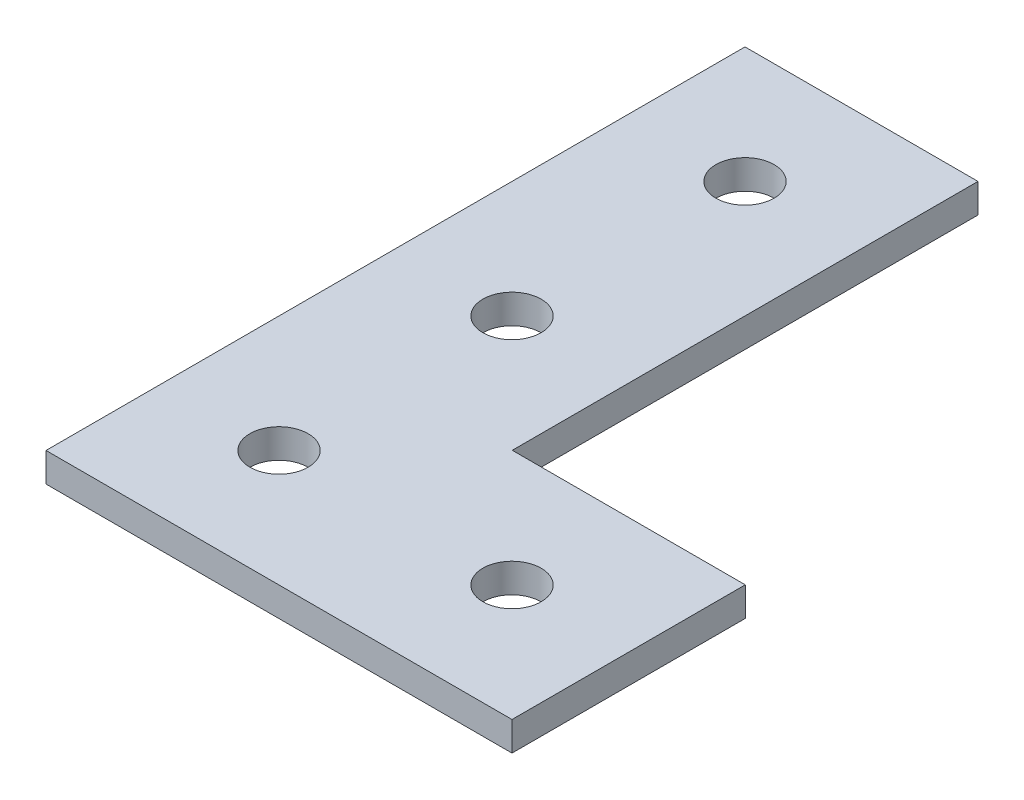
ISO-10303-21;
HEADER;
FILE_DESCRIPTION(('STEP AP214'),'2;1');
FILE_NAME('part.step','',(''),(''),'','','');
FILE_SCHEMA(('AUTOMOTIVE_DESIGN { 1 0 10303 214 1 1 1 1 }'));
ENDSEC;
DATA;
#1=APPLICATION_CONTEXT('core data for automotive mechanical design processes');
#2=APPLICATION_PROTOCOL_DEFINITION('international standard','automotive_design',2000,#1);
#3=PRODUCT_CONTEXT('',#1,'mechanical');
#4=PRODUCT('Part','Part','',(#3));
#5=PRODUCT_RELATED_PRODUCT_CATEGORY('part','',(#4));
#6=PRODUCT_DEFINITION_FORMATION('','',#4);
#7=PRODUCT_DEFINITION_CONTEXT('part definition',#1,'design');
#8=PRODUCT_DEFINITION('design','',#6,#7);
#9=PRODUCT_DEFINITION_SHAPE('','',#8);
#10=(LENGTH_UNIT() NAMED_UNIT(*) SI_UNIT(.MILLI.,.METRE.));
#11=(NAMED_UNIT(*) PLANE_ANGLE_UNIT() SI_UNIT($,.RADIAN.));
#12=(NAMED_UNIT(*) SI_UNIT($,.STERADIAN.) SOLID_ANGLE_UNIT());
#13=UNCERTAINTY_MEASURE_WITH_UNIT(LENGTH_MEASURE(1.E-05),#10,'distance_accuracy_value','');
#14=(GEOMETRIC_REPRESENTATION_CONTEXT(3) GLOBAL_UNCERTAINTY_ASSIGNED_CONTEXT((#13)) GLOBAL_UNIT_ASSIGNED_CONTEXT((#10,
#11,#12)) REPRESENTATION_CONTEXT('',''));
#15=CARTESIAN_POINT('',(0.,0.,0.));
#16=DIRECTION('',(0.,0.,1.));
#17=DIRECTION('',(1.,0.,0.));
#18=AXIS2_PLACEMENT_3D('',#15,#16,#17);
#19=CARTESIAN_POINT('',(50.8,3.175,0.));
#20=DIRECTION('',(0.,0.,-1.));
#21=DIRECTION('',(-1.,0.,0.));
#22=AXIS2_PLACEMENT_3D('',#19,#20,#21);
#23=PLANE('',#22);
#24=DIRECTION('',(1.,0.,0.));
#25=VECTOR('',#24,1.);
#26=CARTESIAN_POINT('',(50.8,0.,0.));
#27=LINE('',#26,#25);
#28=CARTESIAN_POINT('',(0.,0.,0.));
#29=VERTEX_POINT('',#28);
#30=CARTESIAN_POINT('',(50.8,0.,0.));
#31=VERTEX_POINT('',#30);
#32=EDGE_CURVE('E120',#29,#31,#27,.T.);
#33=ORIENTED_EDGE('',*,*,#32,.T.);
#34=DIRECTION('',(0.,-1.,0.));
#35=VECTOR('',#34,1.);
#36=CARTESIAN_POINT('',(50.8,3.175,0.));
#37=LINE('',#36,#35);
#38=CARTESIAN_POINT('',(50.8,3.175,0.));
#39=VERTEX_POINT('',#38);
#40=EDGE_CURVE('E138',#39,#31,#37,.T.);
#41=ORIENTED_EDGE('',*,*,#40,.F.);
#42=DIRECTION('',(1.,0.,0.));
#43=VECTOR('',#42,1.);
#44=CARTESIAN_POINT('',(50.8,3.175,0.));
#45=LINE('',#44,#43);
#46=CARTESIAN_POINT('',(0.,3.175,0.));
#47=VERTEX_POINT('',#46);
#48=EDGE_CURVE('E131',#47,#39,#45,.T.);
#49=ORIENTED_EDGE('',*,*,#48,.F.);
#50=DIRECTION('',(0.,-1.,0.));
#51=VECTOR('',#50,1.);
#52=CARTESIAN_POINT('',(0.,3.175,0.));
#53=LINE('',#52,#51);
#54=EDGE_CURVE('E116',#47,#29,#53,.T.);
#55=ORIENTED_EDGE('',*,*,#54,.T.);
#56=EDGE_LOOP('',(#33,#41,#49,#55));
#57=FACE_BOUND('',#56,.T.);
#58=ADVANCED_FACE('F33',(#57),#23,.F.);
#59=CARTESIAN_POINT('',(50.8,3.175,-25.4295869461767));
#60=DIRECTION('',(-1.,0.,0.));
#61=DIRECTION('',(0.,0.,1.));
#62=AXIS2_PLACEMENT_3D('',#59,#60,#61);
#63=PLANE('',#62);
#64=DIRECTION('',(0.,0.,-1.));
#65=VECTOR('',#64,1.);
#66=CARTESIAN_POINT('',(50.8,0.,-25.4295869461767));
#67=LINE('',#66,#65);
#68=CARTESIAN_POINT('',(50.8,0.,-25.4295869461767));
#69=VERTEX_POINT('',#68);
#70=EDGE_CURVE('E123',#31,#69,#67,.T.);
#71=ORIENTED_EDGE('',*,*,#70,.T.);
#72=DIRECTION('',(0.,-1.,0.));
#73=VECTOR('',#72,1.);
#74=CARTESIAN_POINT('',(50.8,3.175,-25.4295869461767));
#75=LINE('',#74,#73);
#76=CARTESIAN_POINT('',(50.8,3.175,-25.4295869461767));
#77=VERTEX_POINT('',#76);
#78=EDGE_CURVE('E135',#77,#69,#75,.T.);
#79=ORIENTED_EDGE('',*,*,#78,.F.);
#80=DIRECTION('',(0.,0.,-1.));
#81=VECTOR('',#80,1.);
#82=CARTESIAN_POINT('',(50.8,3.175,-25.4295869461767));
#83=LINE('',#82,#81);
#84=EDGE_CURVE('E88',#39,#77,#83,.T.);
#85=ORIENTED_EDGE('',*,*,#84,.F.);
#86=ORIENTED_EDGE('',*,*,#40,.T.);
#87=EDGE_LOOP('',(#71,#79,#85,#86));
#88=FACE_BOUND('',#87,.T.);
#89=ADVANCED_FACE('F165',(#88),#63,.F.);
#90=CARTESIAN_POINT('',(25.4,3.175,-25.4295869461767));
#91=DIRECTION('',(0.,0.,1.));
#92=DIRECTION('',(1.,0.,0.));
#93=AXIS2_PLACEMENT_3D('',#90,#91,#92);
#94=PLANE('',#93);
#95=DIRECTION('',(-1.,0.,0.));
#96=VECTOR('',#95,1.);
#97=CARTESIAN_POINT('',(25.4,0.,-25.4295869461767));
#98=LINE('',#97,#96);
#99=CARTESIAN_POINT('',(25.4,0.,-25.4295869461767));
#100=VERTEX_POINT('',#99);
#101=EDGE_CURVE('E126',#69,#100,#98,.T.);
#102=ORIENTED_EDGE('',*,*,#101,.T.);
#103=DIRECTION('',(0.,-1.,0.));
#104=VECTOR('',#103,1.);
#105=CARTESIAN_POINT('',(25.4,3.175,-25.4295869461767));
#106=LINE('',#105,#104);
#107=CARTESIAN_POINT('',(25.4,3.175,-25.4295869461767));
#108=VERTEX_POINT('',#107);
#109=EDGE_CURVE('E111',#108,#100,#106,.T.);
#110=ORIENTED_EDGE('',*,*,#109,.F.);
#111=DIRECTION('',(-1.,0.,0.));
#112=VECTOR('',#111,1.);
#113=CARTESIAN_POINT('',(25.4,3.175,-25.4295869461767));
#114=LINE('',#113,#112);
#115=EDGE_CURVE('E102',#77,#108,#114,.T.);
#116=ORIENTED_EDGE('',*,*,#115,.F.);
#117=ORIENTED_EDGE('',*,*,#78,.T.);
#118=EDGE_LOOP('',(#102,#110,#116,#117));
#119=FACE_BOUND('',#118,.T.);
#120=ADVANCED_FACE('F170',(#119),#94,.F.);
#121=CARTESIAN_POINT('',(25.4,3.175,-76.2));
#122=DIRECTION('',(-1.,0.,0.));
#123=DIRECTION('',(0.,0.,1.));
#124=AXIS2_PLACEMENT_3D('',#121,#122,#123);
#125=PLANE('',#124);
#126=DIRECTION('',(0.,0.,-1.));
#127=VECTOR('',#126,1.);
#128=CARTESIAN_POINT('',(25.4,0.,-76.2));
#129=LINE('',#128,#127);
#130=CARTESIAN_POINT('',(25.4,0.,-76.2));
#131=VERTEX_POINT('',#130);
#132=EDGE_CURVE('E110',#100,#131,#129,.T.);
#133=ORIENTED_EDGE('',*,*,#132,.T.);
#134=DIRECTION('',(0.,-1.,0.));
#135=VECTOR('',#134,1.);
#136=CARTESIAN_POINT('',(25.4,3.175,-76.2));
#137=LINE('',#136,#135);
#138=CARTESIAN_POINT('',(25.4,3.175,-76.2));
#139=VERTEX_POINT('',#138);
#140=EDGE_CURVE('E107',#139,#131,#137,.T.);
#141=ORIENTED_EDGE('',*,*,#140,.F.);
#142=DIRECTION('',(0.,0.,-1.));
#143=VECTOR('',#142,1.);
#144=CARTESIAN_POINT('',(25.4,3.175,-76.2));
#145=LINE('',#144,#143);
#146=EDGE_CURVE('E95',#108,#139,#145,.T.);
#147=ORIENTED_EDGE('',*,*,#146,.F.);
#148=ORIENTED_EDGE('',*,*,#109,.T.);
#149=EDGE_LOOP('',(#133,#141,#147,#148));
#150=FACE_BOUND('',#149,.T.);
#151=ADVANCED_FACE('F108',(#150),#125,.F.);
#152=CARTESIAN_POINT('',(0.,3.175,-76.2));
#153=DIRECTION('',(0.,0.,1.));
#154=DIRECTION('',(1.,0.,0.));
#155=AXIS2_PLACEMENT_3D('',#152,#153,#154);
#156=PLANE('',#155);
#157=DIRECTION('',(-1.,0.,0.));
#158=VECTOR('',#157,1.);
#159=CARTESIAN_POINT('',(0.,0.,-76.2));
#160=LINE('',#159,#158);
#161=CARTESIAN_POINT('',(0.,0.,-76.2));
#162=VERTEX_POINT('',#161);
#163=EDGE_CURVE('E73',#131,#162,#160,.T.);
#164=ORIENTED_EDGE('',*,*,#163,.T.);
#165=DIRECTION('',(0.,-1.,0.));
#166=VECTOR('',#165,1.);
#167=CARTESIAN_POINT('',(0.,3.175,-76.2));
#168=LINE('',#167,#166);
#169=CARTESIAN_POINT('',(0.,3.175,-76.2));
#170=VERTEX_POINT('',#169);
#171=EDGE_CURVE('E112',#170,#162,#168,.T.);
#172=ORIENTED_EDGE('',*,*,#171,.F.);
#173=DIRECTION('',(-1.,0.,0.));
#174=VECTOR('',#173,1.);
#175=CARTESIAN_POINT('',(0.,3.175,-76.2));
#176=LINE('',#175,#174);
#177=EDGE_CURVE('E100',#139,#170,#176,.T.);
#178=ORIENTED_EDGE('',*,*,#177,.F.);
#179=ORIENTED_EDGE('',*,*,#140,.T.);
#180=EDGE_LOOP('',(#164,#172,#178,#179));
#181=FACE_BOUND('',#180,.T.);
#182=ADVANCED_FACE('F114',(#181),#156,.F.);
#183=CARTESIAN_POINT('',(0.,3.175,0.));
#184=DIRECTION('',(1.,0.,0.));
#185=DIRECTION('',(0.,0.,-1.));
#186=AXIS2_PLACEMENT_3D('',#183,#184,#185);
#187=PLANE('',#186);
#188=DIRECTION('',(0.,0.,1.));
#189=VECTOR('',#188,1.);
#190=CARTESIAN_POINT('',(0.,0.,0.));
#191=LINE('',#190,#189);
#192=EDGE_CURVE('E79',#162,#29,#191,.T.);
#193=ORIENTED_EDGE('',*,*,#192,.T.);
#194=ORIENTED_EDGE('',*,*,#54,.F.);
#195=DIRECTION('',(0.,0.,1.));
#196=VECTOR('',#195,1.);
#197=CARTESIAN_POINT('',(0.,3.175,0.));
#198=LINE('',#197,#196);
#199=EDGE_CURVE('E50',#170,#47,#198,.T.);
#200=ORIENTED_EDGE('',*,*,#199,.F.);
#201=ORIENTED_EDGE('',*,*,#171,.T.);
#202=EDGE_LOOP('',(#193,#194,#200,#201));
#203=FACE_BOUND('',#202,.T.);
#204=ADVANCED_FACE('F150',(#203),#187,.F.);
#205=CARTESIAN_POINT('',(0.,3.175,0.));
#206=DIRECTION('',(0.,-1.,0.));
#207=DIRECTION('',(0.,0.,-1.));
#208=AXIS2_PLACEMENT_3D('',#205,#206,#207);
#209=PLANE('',#208);
#210=CARTESIAN_POINT('',(38.1,3.175,-12.7));
#211=DIRECTION('',(0.,1.,0.));
#212=DIRECTION('',(0.,0.,1.));
#213=AXIS2_PLACEMENT_3D('',#210,#211,#212);
#214=CIRCLE('',#213,3.175);
#215=CARTESIAN_POINT('',(38.1,3.175,-9.525));
#216=VERTEX_POINT('',#215);
#217=EDGE_CURVE('E238',#216,#216,#214,.T.);
#218=ORIENTED_EDGE('',*,*,#217,.F.);
#219=EDGE_LOOP('',(#218));
#220=FACE_BOUND('',#219,.T.);
#221=CARTESIAN_POINT('',(12.7,3.175,-38.1));
#222=DIRECTION('',(0.,1.,0.));
#223=DIRECTION('',(0.,0.,1.));
#224=AXIS2_PLACEMENT_3D('',#221,#222,#223);
#225=CIRCLE('',#224,3.175);
#226=CARTESIAN_POINT('',(12.7,3.175,-34.925));
#227=VERTEX_POINT('',#226);
#228=EDGE_CURVE('E245',#227,#227,#225,.T.);
#229=ORIENTED_EDGE('',*,*,#228,.F.);
#230=EDGE_LOOP('',(#229));
#231=FACE_BOUND('',#230,.T.);
#232=CARTESIAN_POINT('',(12.7,3.175,-12.7));
#233=DIRECTION('',(0.,1.,0.));
#234=DIRECTION('',(0.,0.,1.));
#235=AXIS2_PLACEMENT_3D('',#232,#233,#234);
#236=CIRCLE('',#235,3.175);
#237=CARTESIAN_POINT('',(12.7,3.175,-9.525));
#238=VERTEX_POINT('',#237);
#239=EDGE_CURVE('E248',#238,#238,#236,.T.);
#240=ORIENTED_EDGE('',*,*,#239,.F.);
#241=EDGE_LOOP('',(#240));
#242=FACE_BOUND('',#241,.T.);
#243=ORIENTED_EDGE('',*,*,#48,.T.);
#244=ORIENTED_EDGE('',*,*,#84,.T.);
#245=ORIENTED_EDGE('',*,*,#115,.T.);
#246=ORIENTED_EDGE('',*,*,#146,.T.);
#247=ORIENTED_EDGE('',*,*,#177,.T.);
#248=ORIENTED_EDGE('',*,*,#199,.T.);
#249=EDGE_LOOP('',(#243,#244,#245,#246,#247,#248));
#250=FACE_BOUND('',#249,.T.);
#251=CARTESIAN_POINT('',(12.7,3.175,-63.5));
#252=DIRECTION('',(0.,1.,0.));
#253=DIRECTION('',(0.,0.,1.));
#254=AXIS2_PLACEMENT_3D('',#251,#252,#253);
#255=CIRCLE('',#254,3.175);
#256=CARTESIAN_POINT('',(12.7,3.175,-60.325));
#257=VERTEX_POINT('',#256);
#258=EDGE_CURVE('E11',#257,#257,#255,.T.);
#259=ORIENTED_EDGE('',*,*,#258,.F.);
#260=EDGE_LOOP('',(#259));
#261=FACE_BOUND('',#260,.T.);
#262=ADVANCED_FACE('F97',(#220,#231,#242,#250,#261),#209,.F.);
#263=CARTESIAN_POINT('',(0.,0.,0.));
#264=DIRECTION('',(0.,-1.,0.));
#265=DIRECTION('',(0.,0.,-1.));
#266=AXIS2_PLACEMENT_3D('',#263,#264,#265);
#267=PLANE('',#266);
#268=CARTESIAN_POINT('',(38.1,0.,-12.7));
#269=DIRECTION('',(0.,1.,0.));
#270=DIRECTION('',(0.,0.,1.));
#271=AXIS2_PLACEMENT_3D('',#268,#269,#270);
#272=CIRCLE('',#271,3.175);
#273=CARTESIAN_POINT('',(38.1,0.,-9.525));
#274=VERTEX_POINT('',#273);
#275=EDGE_CURVE('E236',#274,#274,#272,.T.);
#276=ORIENTED_EDGE('',*,*,#275,.T.);
#277=EDGE_LOOP('',(#276));
#278=FACE_BOUND('',#277,.T.);
#279=CARTESIAN_POINT('',(12.7,0.,-38.1));
#280=DIRECTION('',(0.,1.,0.));
#281=DIRECTION('',(0.,0.,1.));
#282=AXIS2_PLACEMENT_3D('',#279,#280,#281);
#283=CIRCLE('',#282,3.175);
#284=CARTESIAN_POINT('',(12.7,0.,-34.925));
#285=VERTEX_POINT('',#284);
#286=EDGE_CURVE('E240',#285,#285,#283,.T.);
#287=ORIENTED_EDGE('',*,*,#286,.T.);
#288=EDGE_LOOP('',(#287));
#289=FACE_BOUND('',#288,.T.);
#290=CARTESIAN_POINT('',(12.7,0.,-12.7));
#291=DIRECTION('',(0.,1.,0.));
#292=DIRECTION('',(0.,0.,1.));
#293=AXIS2_PLACEMENT_3D('',#290,#291,#292);
#294=CIRCLE('',#293,3.175);
#295=CARTESIAN_POINT('',(12.7,0.,-9.525));
#296=VERTEX_POINT('',#295);
#297=EDGE_CURVE('E124',#296,#296,#294,.T.);
#298=ORIENTED_EDGE('',*,*,#297,.T.);
#299=EDGE_LOOP('',(#298));
#300=FACE_BOUND('',#299,.T.);
#301=ORIENTED_EDGE('',*,*,#32,.F.);
#302=ORIENTED_EDGE('',*,*,#192,.F.);
#303=ORIENTED_EDGE('',*,*,#163,.F.);
#304=ORIENTED_EDGE('',*,*,#132,.F.);
#305=ORIENTED_EDGE('',*,*,#101,.F.);
#306=ORIENTED_EDGE('',*,*,#70,.F.);
#307=EDGE_LOOP('',(#301,#302,#303,#304,#305,#306));
#308=FACE_BOUND('',#307,.T.);
#309=CARTESIAN_POINT('',(12.7,0.,-63.5));
#310=DIRECTION('',(0.,1.,0.));
#311=DIRECTION('',(0.,0.,1.));
#312=AXIS2_PLACEMENT_3D('',#309,#310,#311);
#313=CIRCLE('',#312,3.175);
#314=CARTESIAN_POINT('',(12.7,0.,-60.325));
#315=VERTEX_POINT('',#314);
#316=EDGE_CURVE('E42',#315,#315,#313,.T.);
#317=ORIENTED_EDGE('',*,*,#316,.T.);
#318=EDGE_LOOP('',(#317));
#319=FACE_BOUND('',#318,.T.);
#320=ADVANCED_FACE('F142',(#278,#289,#300,#308,#319),#267,.T.);
#321=CARTESIAN_POINT('',(12.7,0.,-12.7));
#322=DIRECTION('',(0.,1.,0.));
#323=DIRECTION('',(0.,0.,1.));
#324=AXIS2_PLACEMENT_3D('',#321,#322,#323);
#325=CYLINDRICAL_SURFACE('',#324,3.175);
#326=ORIENTED_EDGE('',*,*,#297,.F.);
#327=EDGE_LOOP('',(#326));
#328=FACE_BOUND('',#327,.T.);
#329=ORIENTED_EDGE('',*,*,#239,.T.);
#330=EDGE_LOOP('',(#329));
#331=FACE_BOUND('',#330,.T.);
#332=ADVANCED_FACE('F157',(#328,#331),#325,.F.);
#333=CARTESIAN_POINT('',(12.7,0.,-38.1));
#334=DIRECTION('',(0.,1.,0.));
#335=DIRECTION('',(0.,0.,1.));
#336=AXIS2_PLACEMENT_3D('',#333,#334,#335);
#337=CYLINDRICAL_SURFACE('',#336,3.175);
#338=ORIENTED_EDGE('',*,*,#286,.F.);
#339=EDGE_LOOP('',(#338));
#340=FACE_BOUND('',#339,.T.);
#341=ORIENTED_EDGE('',*,*,#228,.T.);
#342=EDGE_LOOP('',(#341));
#343=FACE_BOUND('',#342,.T.);
#344=ADVANCED_FACE('F147',(#340,#343),#337,.F.);
#345=CARTESIAN_POINT('',(12.7,0.,-63.5));
#346=DIRECTION('',(0.,1.,0.));
#347=DIRECTION('',(0.,0.,1.));
#348=AXIS2_PLACEMENT_3D('',#345,#346,#347);
#349=CYLINDRICAL_SURFACE('',#348,3.175);
#350=ORIENTED_EDGE('',*,*,#316,.F.);
#351=EDGE_LOOP('',(#350));
#352=FACE_BOUND('',#351,.T.);
#353=ORIENTED_EDGE('',*,*,#258,.T.);
#354=EDGE_LOOP('',(#353));
#355=FACE_BOUND('',#354,.T.);
#356=ADVANCED_FACE('F35',(#352,#355),#349,.F.);
#357=CARTESIAN_POINT('',(38.1,0.,-12.7));
#358=DIRECTION('',(0.,1.,0.));
#359=DIRECTION('',(0.,0.,1.));
#360=AXIS2_PLACEMENT_3D('',#357,#358,#359);
#361=CYLINDRICAL_SURFACE('',#360,3.175);
#362=ORIENTED_EDGE('',*,*,#275,.F.);
#363=EDGE_LOOP('',(#362));
#364=FACE_BOUND('',#363,.T.);
#365=ORIENTED_EDGE('',*,*,#217,.T.);
#366=EDGE_LOOP('',(#365));
#367=FACE_BOUND('',#366,.T.);
#368=ADVANCED_FACE('F146',(#364,#367),#361,.F.);
#369=CLOSED_SHELL('',(#58,#89,#120,#151,#182,#204,#262,#320,#332,#344,#356,#368));
#370=MANIFOLD_SOLID_BREP('B2',#369);
#371=ADVANCED_BREP_SHAPE_REPRESENTATION('',(#18,#370),#14);
#372=SHAPE_DEFINITION_REPRESENTATION(#9,#371);
ENDSEC;
END-ISO-10303-21;
